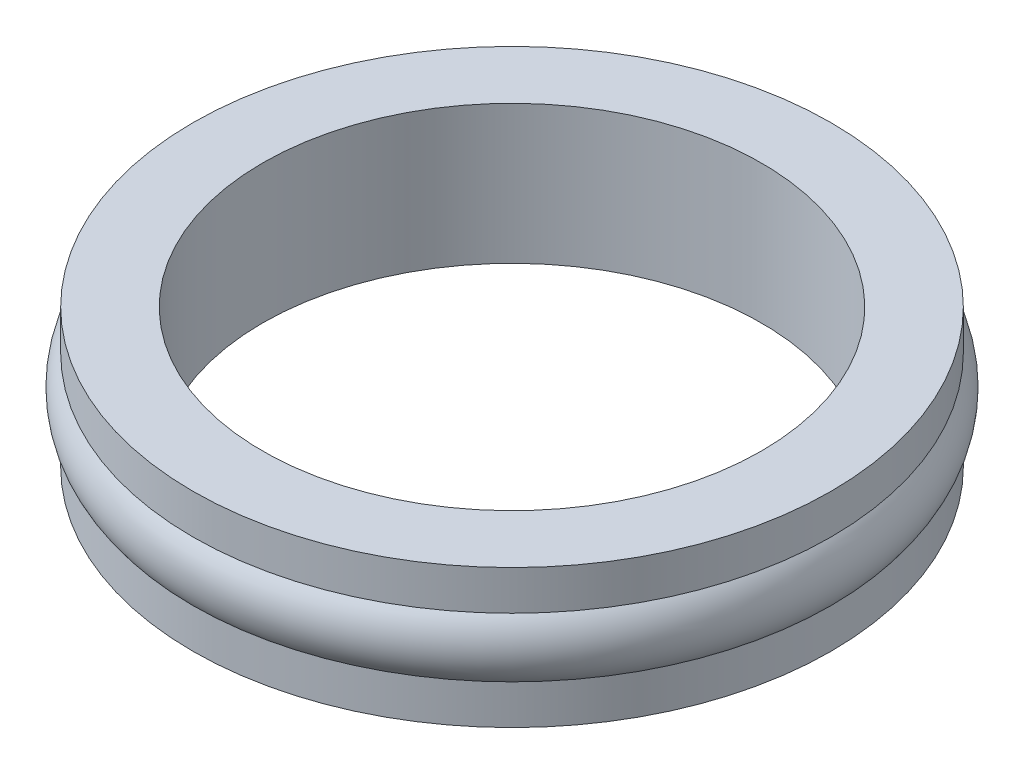
ISO-10303-21;
HEADER;
FILE_DESCRIPTION(('STEP AP214'),'2;1');
FILE_NAME('part.step','',(''),(''),'','','');
FILE_SCHEMA(('AUTOMOTIVE_DESIGN { 1 0 10303 214 1 1 1 1 }'));
ENDSEC;
DATA;
#1=APPLICATION_CONTEXT('core data for automotive mechanical design processes');
#2=APPLICATION_PROTOCOL_DEFINITION('international standard','automotive_design',2000,#1);
#3=PRODUCT_CONTEXT('',#1,'mechanical');
#4=PRODUCT('Part','Part','',(#3));
#5=PRODUCT_RELATED_PRODUCT_CATEGORY('part','',(#4));
#6=PRODUCT_DEFINITION_FORMATION('','',#4);
#7=PRODUCT_DEFINITION_CONTEXT('part definition',#1,'design');
#8=PRODUCT_DEFINITION('design','',#6,#7);
#9=PRODUCT_DEFINITION_SHAPE('','',#8);
#10=(LENGTH_UNIT() NAMED_UNIT(*) SI_UNIT(.MILLI.,.METRE.));
#11=(NAMED_UNIT(*) PLANE_ANGLE_UNIT() SI_UNIT($,.RADIAN.));
#12=(NAMED_UNIT(*) SI_UNIT($,.STERADIAN.) SOLID_ANGLE_UNIT());
#13=UNCERTAINTY_MEASURE_WITH_UNIT(LENGTH_MEASURE(1.E-05),#10,'distance_accuracy_value','');
#14=(GEOMETRIC_REPRESENTATION_CONTEXT(3) GLOBAL_UNCERTAINTY_ASSIGNED_CONTEXT((#13)) GLOBAL_UNIT_ASSIGNED_CONTEXT((#10,
#11,#12)) REPRESENTATION_CONTEXT('',''));
#15=CARTESIAN_POINT('',(0.,0.,0.));
#16=DIRECTION('',(0.,0.,1.));
#17=DIRECTION('',(1.,0.,0.));
#18=AXIS2_PLACEMENT_3D('',#15,#16,#17);
#19=CARTESIAN_POINT('',(4.59637729376451E-13,-133.995441592069,0.));
#20=DIRECTION('',(0.,-1.,0.));
#21=DIRECTION('',(1.,0.,0.));
#22=AXIS2_PLACEMENT_3D('',#19,#20,#21);
#23=CYLINDRICAL_SURFACE('',#22,6.3);
#24=CARTESIAN_POINT('',(0.,-1.28574344901267,0.));
#25=DIRECTION('',(0.,-1.,0.));
#26=DIRECTION('',(1.,0.,0.));
#27=AXIS2_PLACEMENT_3D('',#24,#25,#26);
#28=CIRCLE('',#27,6.3);
#29=CARTESIAN_POINT('',(6.3,-1.28574344901264,0.));
#30=VERTEX_POINT('',#29);
#31=EDGE_CURVE('E65',#30,#30,#28,.T.);
#32=ORIENTED_EDGE('',*,*,#31,.T.);
#33=EDGE_LOOP('',(#32));
#34=FACE_BOUND('',#33,.T.);
#35=CARTESIAN_POINT('',(0.,2.21425655098734,0.));
#36=DIRECTION('',(0.,-1.,0.));
#37=DIRECTION('',(1.,0.,0.));
#38=AXIS2_PLACEMENT_3D('',#35,#36,#37);
#39=CIRCLE('',#38,6.30000000000001);
#40=CARTESIAN_POINT('',(6.3,2.21425655098736,0.));
#41=VERTEX_POINT('',#40);
#42=EDGE_CURVE('E10',#41,#41,#39,.T.);
#43=ORIENTED_EDGE('',*,*,#42,.F.);
#44=EDGE_LOOP('',(#43));
#45=FACE_BOUND('',#44,.T.);
#46=ADVANCED_FACE('F36',(#34,#45),#23,.F.);
#47=CARTESIAN_POINT('',(6.3,2.21425655098735,0.));
#48=DIRECTION('',(0.,1.,0.));
#49=DIRECTION('',(-1.,0.,0.));
#50=AXIS2_PLACEMENT_3D('',#47,#48,#49);
#51=PLANE('',#50);
#52=ORIENTED_EDGE('',*,*,#42,.T.);
#53=EDGE_LOOP('',(#52));
#54=FACE_BOUND('',#53,.T.);
#55=CARTESIAN_POINT('',(0.,2.21425655098734,0.));
#56=DIRECTION('',(0.,-1.,0.));
#57=DIRECTION('',(1.,0.,0.));
#58=AXIS2_PLACEMENT_3D('',#55,#56,#57);
#59=CIRCLE('',#58,8.06000000000001);
#60=CARTESIAN_POINT('',(8.06,2.21425655098736,0.));
#61=VERTEX_POINT('',#60);
#62=EDGE_CURVE('E43',#61,#61,#59,.T.);
#63=ORIENTED_EDGE('',*,*,#62,.F.);
#64=EDGE_LOOP('',(#63));
#65=FACE_BOUND('',#64,.T.);
#66=ADVANCED_FACE('F85',(#54,#65),#51,.T.);
#67=CARTESIAN_POINT('',(4.59637729376451E-13,-133.995441592069,0.));
#68=DIRECTION('',(0.,-1.,0.));
#69=DIRECTION('',(1.,0.,0.));
#70=AXIS2_PLACEMENT_3D('',#67,#68,#69);
#71=CYLINDRICAL_SURFACE('',#70,8.06000000000001);
#72=ORIENTED_EDGE('',*,*,#62,.T.);
#73=EDGE_LOOP('',(#72));
#74=FACE_BOUND('',#73,.T.);
#75=CARTESIAN_POINT('',(0.,1.21425655098734,0.));
#76=DIRECTION('',(0.,-1.,0.));
#77=DIRECTION('',(1.,0.,0.));
#78=AXIS2_PLACEMENT_3D('',#75,#76,#77);
#79=CIRCLE('',#78,8.06);
#80=CARTESIAN_POINT('',(8.06,1.21425655098736,0.));
#81=VERTEX_POINT('',#80);
#82=EDGE_CURVE('E49',#81,#81,#79,.T.);
#83=ORIENTED_EDGE('',*,*,#82,.F.);
#84=EDGE_LOOP('',(#83));
#85=FACE_BOUND('',#84,.T.);
#86=ADVANCED_FACE('F89',(#74,#85),#71,.T.);
#87=CARTESIAN_POINT('',(0.,0.464256550987329,0.));
#88=DIRECTION('',(0.,-1.,0.));
#89=DIRECTION('',(1.,0.,0.));
#90=AXIS2_PLACEMENT_3D('',#87,#88,#89);
#91=TOROIDAL_SURFACE('',#90,7.12325030024024,1.2);
#92=ORIENTED_EDGE('',*,*,#82,.T.);
#93=EDGE_LOOP('',(#92));
#94=FACE_BOUND('',#93,.T.);
#95=CARTESIAN_POINT('',(0.,-0.285743449012665,0.));
#96=DIRECTION('',(0.,-1.,0.));
#97=DIRECTION('',(1.,0.,0.));
#98=AXIS2_PLACEMENT_3D('',#95,#96,#97);
#99=CIRCLE('',#98,8.06);
#100=CARTESIAN_POINT('',(8.06,-0.285743449012638,0.));
#101=VERTEX_POINT('',#100);
#102=EDGE_CURVE('E55',#101,#101,#99,.T.);
#103=ORIENTED_EDGE('',*,*,#102,.F.);
#104=EDGE_LOOP('',(#103));
#105=FACE_BOUND('',#104,.T.);
#106=ADVANCED_FACE('F81',(#94,#105),#91,.T.);
#107=CARTESIAN_POINT('',(4.59637729376451E-13,-133.995441592069,0.));
#108=DIRECTION('',(0.,-1.,0.));
#109=DIRECTION('',(1.,0.,0.));
#110=AXIS2_PLACEMENT_3D('',#107,#108,#109);
#111=CYLINDRICAL_SURFACE('',#110,8.06);
#112=ORIENTED_EDGE('',*,*,#102,.T.);
#113=EDGE_LOOP('',(#112));
#114=FACE_BOUND('',#113,.T.);
#115=CARTESIAN_POINT('',(0.,-1.28574344901267,0.));
#116=DIRECTION('',(0.,-1.,0.));
#117=DIRECTION('',(1.,0.,0.));
#118=AXIS2_PLACEMENT_3D('',#115,#116,#117);
#119=CIRCLE('',#118,8.06);
#120=CARTESIAN_POINT('',(8.06,-1.28574344901264,0.));
#121=VERTEX_POINT('',#120);
#122=EDGE_CURVE('E61',#121,#121,#119,.T.);
#123=ORIENTED_EDGE('',*,*,#122,.F.);
#124=EDGE_LOOP('',(#123));
#125=FACE_BOUND('',#124,.T.);
#126=ADVANCED_FACE('F75',(#114,#125),#111,.T.);
#127=CARTESIAN_POINT('',(6.3,-1.28574344901265,0.));
#128=DIRECTION('',(0.,-1.,0.));
#129=DIRECTION('',(1.,0.,0.));
#130=AXIS2_PLACEMENT_3D('',#127,#128,#129);
#131=PLANE('',#130);
#132=ORIENTED_EDGE('',*,*,#122,.T.);
#133=EDGE_LOOP('',(#132));
#134=FACE_BOUND('',#133,.T.);
#135=ORIENTED_EDGE('',*,*,#31,.F.);
#136=EDGE_LOOP('',(#135));
#137=FACE_BOUND('',#136,.T.);
#138=ADVANCED_FACE('F73',(#134,#137),#131,.T.);
#139=CLOSED_SHELL('',(#46,#66,#86,#106,#126,#138));
#140=MANIFOLD_SOLID_BREP('B2',#139);
#141=ADVANCED_BREP_SHAPE_REPRESENTATION('',(#18,#140),#14);
#142=SHAPE_DEFINITION_REPRESENTATION(#9,#141);
ENDSEC;
END-ISO-10303-21;
